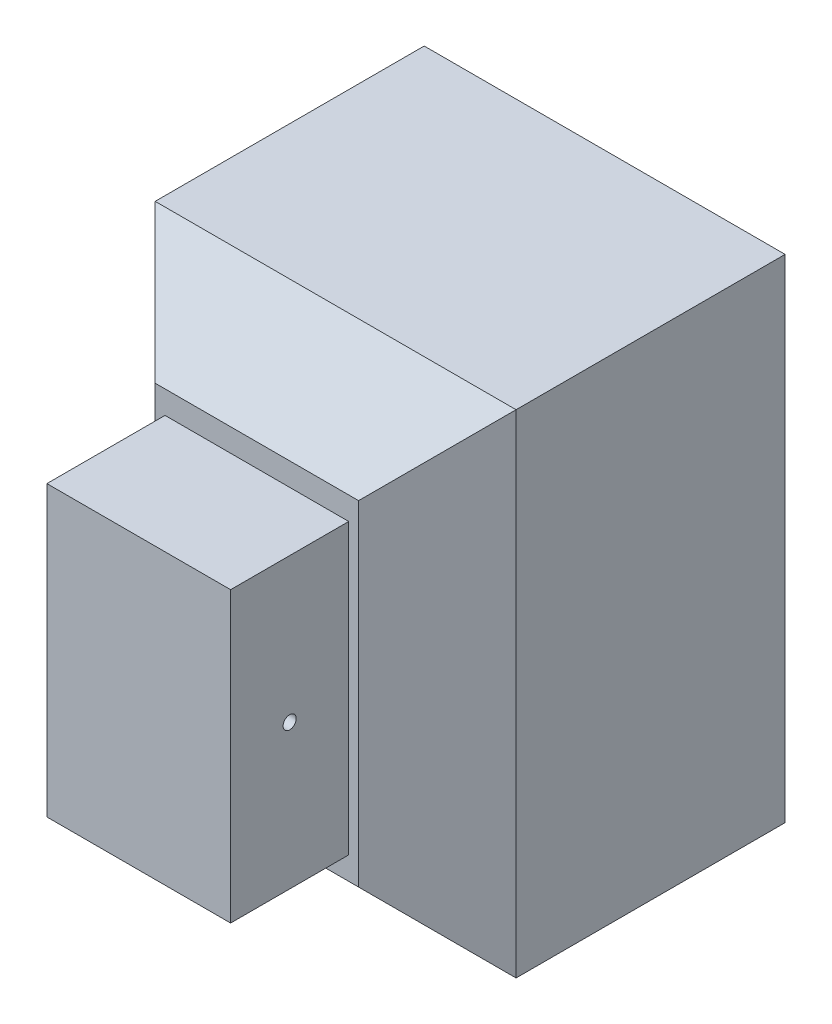
ISO-10303-21;
HEADER;
FILE_DESCRIPTION(('STEP AP214'),'2;1');
FILE_NAME('part.step','',(''),(''),'','','');
FILE_SCHEMA(('AUTOMOTIVE_DESIGN { 1 0 10303 214 1 1 1 1 }'));
ENDSEC;
DATA;
#1=APPLICATION_CONTEXT('core data for automotive mechanical design processes');
#2=APPLICATION_PROTOCOL_DEFINITION('international standard','automotive_design',2000,#1);
#3=PRODUCT_CONTEXT('',#1,'mechanical');
#4=PRODUCT('Part','Part','',(#3));
#5=PRODUCT_RELATED_PRODUCT_CATEGORY('part','',(#4));
#6=PRODUCT_DEFINITION_FORMATION('','',#4);
#7=PRODUCT_DEFINITION_CONTEXT('part definition',#1,'design');
#8=PRODUCT_DEFINITION('design','',#6,#7);
#9=PRODUCT_DEFINITION_SHAPE('','',#8);
#10=(LENGTH_UNIT() NAMED_UNIT(*) SI_UNIT(.MILLI.,.METRE.));
#11=(NAMED_UNIT(*) PLANE_ANGLE_UNIT() SI_UNIT($,.RADIAN.));
#12=(NAMED_UNIT(*) SI_UNIT($,.STERADIAN.) SOLID_ANGLE_UNIT());
#13=UNCERTAINTY_MEASURE_WITH_UNIT(LENGTH_MEASURE(1.E-05),#10,'distance_accuracy_value','');
#14=(GEOMETRIC_REPRESENTATION_CONTEXT(3) GLOBAL_UNCERTAINTY_ASSIGNED_CONTEXT((#13)) GLOBAL_UNIT_ASSIGNED_CONTEXT((#10,
#11,#12)) REPRESENTATION_CONTEXT('',''));
#15=CARTESIAN_POINT('',(0.,0.,0.));
#16=DIRECTION('',(0.,0.,1.));
#17=DIRECTION('',(1.,0.,0.));
#18=AXIS2_PLACEMENT_3D('',#15,#16,#17);
#19=CARTESIAN_POINT('',(55.,-32.1033210332103,29.2988929889299));
#20=DIRECTION('',(0.,0.,-1.));
#21=DIRECTION('',(-1.,0.,0.));
#22=AXIS2_PLACEMENT_3D('',#19,#20,#21);
#23=PLANE('',#22);
#24=DIRECTION('',(0.,-1.,0.));
#25=VECTOR('',#24,1.);
#26=CARTESIAN_POINT('',(12.0000000000001,-32.1033210332103,29.2988929889299));
#27=LINE('',#26,#25);
#28=CARTESIAN_POINT('',(12.0000000000001,30.8966789667896,29.2988929889299));
#29=VERTEX_POINT('',#28);
#30=CARTESIAN_POINT('',(12.0000000000001,-20.1033210332103,29.2988929889299));
#31=VERTEX_POINT('',#30);
#32=EDGE_CURVE('E185',#29,#31,#27,.T.);
#33=ORIENTED_EDGE('',*,*,#32,.T.);
#34=DIRECTION('',(1.,0.,0.));
#35=VECTOR('',#34,1.);
#36=CARTESIAN_POINT('',(55.,-20.1033210332103,29.2988929889299));
#37=LINE('',#36,#35);
#38=CARTESIAN_POINT('',(43.,-20.1033210332103,29.2988929889299));
#39=VERTEX_POINT('',#38);
#40=EDGE_CURVE('E187',#31,#39,#37,.T.);
#41=ORIENTED_EDGE('',*,*,#40,.T.);
#42=DIRECTION('',(0.,1.,0.));
#43=VECTOR('',#42,1.);
#44=CARTESIAN_POINT('',(43.,42.8966789667897,29.2988929889299));
#45=LINE('',#44,#43);
#46=CARTESIAN_POINT('',(43.,30.8966789667896,29.2988929889299));
#47=VERTEX_POINT('',#46);
#48=EDGE_CURVE('E181',#39,#47,#45,.T.);
#49=ORIENTED_EDGE('',*,*,#48,.T.);
#50=DIRECTION('',(-1.,0.,0.));
#51=VECTOR('',#50,1.);
#52=CARTESIAN_POINT('',(55.,30.8966789667896,29.2988929889299));
#53=LINE('',#52,#51);
#54=EDGE_CURVE('E183',#47,#29,#53,.T.);
#55=ORIENTED_EDGE('',*,*,#54,.T.);
#56=EDGE_LOOP('',(#33,#41,#49,#55));
#57=FACE_BOUND('',#56,.T.);
#58=DIRECTION('',(0.,-1.,0.));
#59=VECTOR('',#58,1.);
#60=CARTESIAN_POINT('',(13.5,27.3966789667897,29.2988929889299));
#61=LINE('',#60,#59);
#62=CARTESIAN_POINT('',(13.5,27.3966789667897,29.2988929889299));
#63=VERTEX_POINT('',#62);
#64=CARTESIAN_POINT('',(13.5,-16.6033210332103,29.2988929889299));
#65=VERTEX_POINT('',#64);
#66=EDGE_CURVE('E157',#63,#65,#61,.T.);
#67=ORIENTED_EDGE('',*,*,#66,.F.);
#68=DIRECTION('',(-1.,0.,0.));
#69=VECTOR('',#68,1.);
#70=CARTESIAN_POINT('',(13.5,27.3966789667897,29.2988929889299));
#71=LINE('',#70,#69);
#72=CARTESIAN_POINT('',(41.5,27.3966789667897,29.2988929889299));
#73=VERTEX_POINT('',#72);
#74=EDGE_CURVE('E154',#73,#63,#71,.T.);
#75=ORIENTED_EDGE('',*,*,#74,.F.);
#76=DIRECTION('',(0.,1.,0.));
#77=VECTOR('',#76,1.);
#78=CARTESIAN_POINT('',(41.5,27.3966789667897,29.2988929889299));
#79=LINE('',#78,#77);
#80=CARTESIAN_POINT('',(41.5,-16.6033210332103,29.2988929889299));
#81=VERTEX_POINT('',#80);
#82=EDGE_CURVE('E450',#81,#73,#79,.T.);
#83=ORIENTED_EDGE('',*,*,#82,.F.);
#84=DIRECTION('',(1.,0.,0.));
#85=VECTOR('',#84,1.);
#86=CARTESIAN_POINT('',(13.5,-16.6033210332103,29.2988929889299));
#87=LINE('',#86,#85);
#88=EDGE_CURVE('E448',#65,#81,#87,.T.);
#89=ORIENTED_EDGE('',*,*,#88,.F.);
#90=EDGE_LOOP('',(#67,#75,#83,#89));
#91=FACE_BOUND('',#90,.T.);
#92=ADVANCED_FACE('F41',(#57,#91),#23,.F.);
#93=CARTESIAN_POINT('',(55.,-32.1033210332103,29.2988929889299));
#94=DIRECTION('',(0.,1.,0.));
#95=DIRECTION('',(0.,0.,1.));
#96=AXIS2_PLACEMENT_3D('',#93,#94,#95);
#97=PLANE('',#96);
#98=DIRECTION('',(0.,0.,-1.));
#99=VECTOR('',#98,1.);
#100=CARTESIAN_POINT('',(55.,-32.1033210332103,29.2988929889299));
#101=LINE('',#100,#99);
#102=CARTESIAN_POINT('',(55.,-32.1033210332103,17.2988929889299));
#103=VERTEX_POINT('',#102);
#104=CARTESIAN_POINT('',(55.,-32.1033210332103,-23.7011070110701));
#105=VERTEX_POINT('',#104);
#106=EDGE_CURVE('E167',#103,#105,#101,.T.);
#107=ORIENTED_EDGE('',*,*,#106,.F.);
#108=DIRECTION('',(-1.,0.,0.));
#109=VECTOR('',#108,1.);
#110=CARTESIAN_POINT('',(55.,-32.1033210332103,17.2988929889299));
#111=LINE('',#110,#109);
#112=CARTESIAN_POINT('',(0.,-32.1033210332103,17.2988929889299));
#113=VERTEX_POINT('',#112);
#114=EDGE_CURVE('E178',#103,#113,#111,.T.);
#115=ORIENTED_EDGE('',*,*,#114,.T.);
#116=DIRECTION('',(0.,0.,-1.));
#117=VECTOR('',#116,1.);
#118=CARTESIAN_POINT('',(0.,-32.1033210332103,29.2988929889299));
#119=LINE('',#118,#117);
#120=CARTESIAN_POINT('',(0.,-32.1033210332103,-23.7011070110701));
#121=VERTEX_POINT('',#120);
#122=EDGE_CURVE('E158',#113,#121,#119,.T.);
#123=ORIENTED_EDGE('',*,*,#122,.T.);
#124=DIRECTION('',(1.,0.,0.));
#125=VECTOR('',#124,1.);
#126=CARTESIAN_POINT('',(55.,-32.1033210332103,-23.7011070110701));
#127=LINE('',#126,#125);
#128=EDGE_CURVE('E172',#121,#105,#127,.T.);
#129=ORIENTED_EDGE('',*,*,#128,.T.);
#130=EDGE_LOOP('',(#107,#115,#123,#129));
#131=FACE_BOUND('',#130,.T.);
#132=ADVANCED_FACE('F252',(#131),#97,.F.);
#133=CARTESIAN_POINT('',(55.,-32.1033210332103,-35.7011070110701));
#134=DIRECTION('',(0.,0.,1.));
#135=DIRECTION('',(1.,0.,0.));
#136=AXIS2_PLACEMENT_3D('',#133,#134,#135);
#137=PLANE('',#136);
#138=DIRECTION('',(0.,-1.,0.));
#139=VECTOR('',#138,1.);
#140=CARTESIAN_POINT('',(43.,-32.1033210332103,-35.7011070110701));
#141=LINE('',#140,#139);
#142=CARTESIAN_POINT('',(43.,30.8966789667896,-35.7011070110701));
#143=VERTEX_POINT('',#142);
#144=CARTESIAN_POINT('',(43.,-20.1033210332103,-35.7011070110701));
#145=VERTEX_POINT('',#144);
#146=EDGE_CURVE('E202',#143,#145,#141,.T.);
#147=ORIENTED_EDGE('',*,*,#146,.T.);
#148=DIRECTION('',(-1.,0.,0.));
#149=VECTOR('',#148,1.);
#150=CARTESIAN_POINT('',(55.,-20.1033210332103,-35.7011070110701));
#151=LINE('',#150,#149);
#152=CARTESIAN_POINT('',(12.0000000000001,-20.1033210332103,-35.7011070110701));
#153=VERTEX_POINT('',#152);
#154=EDGE_CURVE('E11',#145,#153,#151,.T.);
#155=ORIENTED_EDGE('',*,*,#154,.T.);
#156=DIRECTION('',(0.,1.,0.));
#157=VECTOR('',#156,1.);
#158=CARTESIAN_POINT('',(12.0000000000001,-32.1033210332103,-35.7011070110701));
#159=LINE('',#158,#157);
#160=CARTESIAN_POINT('',(12.0000000000001,30.8966789667896,-35.7011070110701));
#161=VERTEX_POINT('',#160);
#162=EDGE_CURVE('E51',#153,#161,#159,.T.);
#163=ORIENTED_EDGE('',*,*,#162,.T.);
#164=DIRECTION('',(1.,0.,0.));
#165=VECTOR('',#164,1.);
#166=CARTESIAN_POINT('',(55.,30.8966789667896,-35.7011070110701));
#167=LINE('',#166,#165);
#168=EDGE_CURVE('E204',#161,#143,#167,.T.);
#169=ORIENTED_EDGE('',*,*,#168,.T.);
#170=EDGE_LOOP('',(#147,#155,#163,#169));
#171=FACE_BOUND('',#170,.T.);
#172=ADVANCED_FACE('F284',(#171),#137,.F.);
#173=CARTESIAN_POINT('',(55.,42.8966789667897,29.2988929889299));
#174=DIRECTION('',(0.,-1.,0.));
#175=DIRECTION('',(0.,0.,-1.));
#176=AXIS2_PLACEMENT_3D('',#173,#174,#175);
#177=PLANE('',#176);
#178=DIRECTION('',(0.,0.,1.));
#179=VECTOR('',#178,1.);
#180=CARTESIAN_POINT('',(0.,42.8966789667897,29.2988929889299));
#181=LINE('',#180,#179);
#182=CARTESIAN_POINT('',(0.,42.8966789667897,-23.7011070110701));
#183=VERTEX_POINT('',#182);
#184=CARTESIAN_POINT('',(0.,42.8966789667897,17.2988929889299));
#185=VERTEX_POINT('',#184);
#186=EDGE_CURVE('E161',#183,#185,#181,.T.);
#187=ORIENTED_EDGE('',*,*,#186,.T.);
#188=DIRECTION('',(1.,0.,0.));
#189=VECTOR('',#188,1.);
#190=CARTESIAN_POINT('',(55.,42.8966789667897,17.2988929889299));
#191=LINE('',#190,#189);
#192=CARTESIAN_POINT('',(55.,42.8966789667897,17.2988929889299));
#193=VERTEX_POINT('',#192);
#194=EDGE_CURVE('E196',#185,#193,#191,.T.);
#195=ORIENTED_EDGE('',*,*,#194,.T.);
#196=DIRECTION('',(0.,0.,1.));
#197=VECTOR('',#196,1.);
#198=CARTESIAN_POINT('',(55.,42.8966789667897,29.2988929889299));
#199=LINE('',#198,#197);
#200=CARTESIAN_POINT('',(55.,42.8966789667897,-23.7011070110701));
#201=VERTEX_POINT('',#200);
#202=EDGE_CURVE('E170',#201,#193,#199,.T.);
#203=ORIENTED_EDGE('',*,*,#202,.F.);
#204=DIRECTION('',(-1.,0.,0.));
#205=VECTOR('',#204,1.);
#206=CARTESIAN_POINT('',(55.,42.8966789667897,-23.7011070110701));
#207=LINE('',#206,#205);
#208=EDGE_CURVE('E194',#201,#183,#207,.T.);
#209=ORIENTED_EDGE('',*,*,#208,.T.);
#210=EDGE_LOOP('',(#187,#195,#203,#209));
#211=FACE_BOUND('',#210,.T.);
#212=ADVANCED_FACE('F238',(#211),#177,.F.);
#213=CARTESIAN_POINT('',(55.,0.,0.));
#214=DIRECTION('',(1.,0.,0.));
#215=DIRECTION('',(0.,0.,-1.));
#216=AXIS2_PLACEMENT_3D('',#213,#214,#215);
#217=PLANE('',#216);
#218=ORIENTED_EDGE('',*,*,#202,.T.);
#219=DIRECTION('',(0.,-1.,0.));
#220=VECTOR('',#219,1.);
#221=CARTESIAN_POINT('',(55.,-32.1033210332103,17.2988929889299));
#222=LINE('',#221,#220);
#223=EDGE_CURVE('E200',#193,#103,#222,.T.);
#224=ORIENTED_EDGE('',*,*,#223,.T.);
#225=ORIENTED_EDGE('',*,*,#106,.T.);
#226=DIRECTION('',(0.,1.,0.));
#227=VECTOR('',#226,1.);
#228=CARTESIAN_POINT('',(55.,42.8966789667897,-23.7011070110701));
#229=LINE('',#228,#227);
#230=EDGE_CURVE('E198',#105,#201,#229,.T.);
#231=ORIENTED_EDGE('',*,*,#230,.T.);
#232=EDGE_LOOP('',(#218,#224,#225,#231));
#233=FACE_BOUND('',#232,.T.);
#234=ADVANCED_FACE('F266',(#233),#217,.T.);
#235=CARTESIAN_POINT('',(0.,0.,0.));
#236=DIRECTION('',(1.,0.,0.));
#237=DIRECTION('',(0.,0.,-1.));
#238=AXIS2_PLACEMENT_3D('',#235,#236,#237);
#239=PLANE('',#238);
#240=ORIENTED_EDGE('',*,*,#122,.F.);
#241=DIRECTION('',(0.,1.,0.));
#242=VECTOR('',#241,1.);
#243=CARTESIAN_POINT('',(0.,0.,17.2988929889299));
#244=LINE('',#243,#242);
#245=EDGE_CURVE('E192',#113,#185,#244,.T.);
#246=ORIENTED_EDGE('',*,*,#245,.T.);
#247=ORIENTED_EDGE('',*,*,#186,.F.);
#248=DIRECTION('',(0.,-1.,0.));
#249=VECTOR('',#248,1.);
#250=CARTESIAN_POINT('',(0.,0.,-23.7011070110701));
#251=LINE('',#250,#249);
#252=EDGE_CURVE('E190',#183,#121,#251,.T.);
#253=ORIENTED_EDGE('',*,*,#252,.T.);
#254=EDGE_LOOP('',(#240,#246,#247,#253));
#255=FACE_BOUND('',#254,.T.);
#256=ADVANCED_FACE('F242',(#255),#239,.F.);
#257=CARTESIAN_POINT('',(13.5,27.3966789667897,47.2988929889299));
#258=DIRECTION('',(1.,0.,0.));
#259=DIRECTION('',(0.,1.,0.));
#260=AXIS2_PLACEMENT_3D('',#257,#258,#259);
#261=PLANE('',#260);
#262=CARTESIAN_POINT('',(13.5,5.39667896678966,38.2988929889299));
#263=DIRECTION('',(1.,0.,0.));
#264=DIRECTION('',(0.,1.,0.));
#265=AXIS2_PLACEMENT_3D('',#262,#263,#264);
#266=CIRCLE('',#265,1.);
#267=CARTESIAN_POINT('',(13.5,6.39667896678966,38.2988929889299));
#268=VERTEX_POINT('',#267);
#269=EDGE_CURVE('E220',#268,#268,#266,.T.);
#270=ORIENTED_EDGE('',*,*,#269,.T.);
#271=EDGE_LOOP('',(#270));
#272=FACE_BOUND('',#271,.T.);
#273=ORIENTED_EDGE('',*,*,#66,.T.);
#274=DIRECTION('',(0.,0.,-1.));
#275=VECTOR('',#274,1.);
#276=CARTESIAN_POINT('',(13.5,-16.6033210332103,47.2988929889299));
#277=LINE('',#276,#275);
#278=CARTESIAN_POINT('',(13.5,-16.6033210332103,47.2988929889299));
#279=VERTEX_POINT('',#278);
#280=EDGE_CURVE('E138',#279,#65,#277,.T.);
#281=ORIENTED_EDGE('',*,*,#280,.F.);
#282=DIRECTION('',(0.,-1.,0.));
#283=VECTOR('',#282,1.);
#284=CARTESIAN_POINT('',(13.5,27.3966789667897,47.2988929889299));
#285=LINE('',#284,#283);
#286=CARTESIAN_POINT('',(13.5,27.3966789667897,47.2988929889299));
#287=VERTEX_POINT('',#286);
#288=EDGE_CURVE('E145',#287,#279,#285,.T.);
#289=ORIENTED_EDGE('',*,*,#288,.F.);
#290=DIRECTION('',(0.,0.,-1.));
#291=VECTOR('',#290,1.);
#292=CARTESIAN_POINT('',(13.5,27.3966789667897,47.2988929889299));
#293=LINE('',#292,#291);
#294=EDGE_CURVE('E446',#287,#63,#293,.T.);
#295=ORIENTED_EDGE('',*,*,#294,.T.);
#296=EDGE_LOOP('',(#273,#281,#289,#295));
#297=FACE_BOUND('',#296,.T.);
#298=ADVANCED_FACE('F156',(#272,#297),#261,.F.);
#299=CARTESIAN_POINT('',(13.5,-16.6033210332103,47.2988929889299));
#300=DIRECTION('',(0.,1.,0.));
#301=DIRECTION('',(-1.,0.,0.));
#302=AXIS2_PLACEMENT_3D('',#299,#300,#301);
#303=PLANE('',#302);
#304=ORIENTED_EDGE('',*,*,#88,.T.);
#305=DIRECTION('',(0.,0.,-1.));
#306=VECTOR('',#305,1.);
#307=CARTESIAN_POINT('',(41.5,-16.6033210332103,47.2988929889299));
#308=LINE('',#307,#306);
#309=CARTESIAN_POINT('',(41.5,-16.6033210332103,47.2988929889299));
#310=VERTEX_POINT('',#309);
#311=EDGE_CURVE('E141',#310,#81,#308,.T.);
#312=ORIENTED_EDGE('',*,*,#311,.F.);
#313=DIRECTION('',(1.,0.,0.));
#314=VECTOR('',#313,1.);
#315=CARTESIAN_POINT('',(13.5,-16.6033210332103,47.2988929889299));
#316=LINE('',#315,#314);
#317=EDGE_CURVE('E133',#279,#310,#316,.T.);
#318=ORIENTED_EDGE('',*,*,#317,.F.);
#319=ORIENTED_EDGE('',*,*,#280,.T.);
#320=EDGE_LOOP('',(#304,#312,#318,#319));
#321=FACE_BOUND('',#320,.T.);
#322=ADVANCED_FACE('F136',(#321),#303,.F.);
#323=CARTESIAN_POINT('',(41.5,27.3966789667897,47.2988929889299));
#324=DIRECTION('',(-1.,0.,0.));
#325=DIRECTION('',(0.,0.,1.));
#326=AXIS2_PLACEMENT_3D('',#323,#324,#325);
#327=PLANE('',#326);
#328=CARTESIAN_POINT('',(41.5,5.39667896678966,38.2988929889299));
#329=DIRECTION('',(-1.,0.,0.));
#330=DIRECTION('',(0.,0.,1.));
#331=AXIS2_PLACEMENT_3D('',#328,#329,#330);
#332=CIRCLE('',#331,1.);
#333=CARTESIAN_POINT('',(41.5,5.39667896678966,39.2988929889299));
#334=VERTEX_POINT('',#333);
#335=EDGE_CURVE('E46',#334,#334,#332,.T.);
#336=ORIENTED_EDGE('',*,*,#335,.T.);
#337=EDGE_LOOP('',(#336));
#338=FACE_BOUND('',#337,.T.);
#339=ORIENTED_EDGE('',*,*,#82,.T.);
#340=DIRECTION('',(0.,0.,-1.));
#341=VECTOR('',#340,1.);
#342=CARTESIAN_POINT('',(41.5,27.3966789667897,47.2988929889299));
#343=LINE('',#342,#341);
#344=CARTESIAN_POINT('',(41.5,27.3966789667897,47.2988929889299));
#345=VERTEX_POINT('',#344);
#346=EDGE_CURVE('E163',#345,#73,#343,.T.);
#347=ORIENTED_EDGE('',*,*,#346,.F.);
#348=DIRECTION('',(0.,1.,0.));
#349=VECTOR('',#348,1.);
#350=CARTESIAN_POINT('',(41.5,27.3966789667897,47.2988929889299));
#351=LINE('',#350,#349);
#352=EDGE_CURVE('E144',#310,#345,#351,.T.);
#353=ORIENTED_EDGE('',*,*,#352,.F.);
#354=ORIENTED_EDGE('',*,*,#311,.T.);
#355=EDGE_LOOP('',(#339,#347,#353,#354));
#356=FACE_BOUND('',#355,.T.);
#357=ADVANCED_FACE('F367',(#338,#356),#327,.F.);
#358=CARTESIAN_POINT('',(13.5,27.3966789667897,47.2988929889299));
#359=DIRECTION('',(0.,-1.,0.));
#360=DIRECTION('',(1.,0.,0.));
#361=AXIS2_PLACEMENT_3D('',#358,#359,#360);
#362=PLANE('',#361);
#363=ORIENTED_EDGE('',*,*,#74,.T.);
#364=ORIENTED_EDGE('',*,*,#294,.F.);
#365=DIRECTION('',(-1.,0.,0.));
#366=VECTOR('',#365,1.);
#367=CARTESIAN_POINT('',(13.5,27.3966789667897,47.2988929889299));
#368=LINE('',#367,#366);
#369=EDGE_CURVE('E150',#345,#287,#368,.T.);
#370=ORIENTED_EDGE('',*,*,#369,.F.);
#371=ORIENTED_EDGE('',*,*,#346,.T.);
#372=EDGE_LOOP('',(#363,#364,#370,#371));
#373=FACE_BOUND('',#372,.T.);
#374=ADVANCED_FACE('F358',(#373),#362,.F.);
#375=CARTESIAN_POINT('',(0.,0.,47.2988929889299));
#376=DIRECTION('',(0.,0.,1.));
#377=DIRECTION('',(1.,0.,0.));
#378=AXIS2_PLACEMENT_3D('',#375,#376,#377);
#379=PLANE('',#378);
#380=ORIENTED_EDGE('',*,*,#288,.T.);
#381=ORIENTED_EDGE('',*,*,#317,.T.);
#382=ORIENTED_EDGE('',*,*,#352,.T.);
#383=ORIENTED_EDGE('',*,*,#369,.T.);
#384=EDGE_LOOP('',(#380,#381,#382,#383));
#385=FACE_BOUND('',#384,.T.);
#386=ADVANCED_FACE('F148',(#385),#379,.T.);
#387=CARTESIAN_POINT('',(55.,30.8966789667896,29.2988929889299));
#388=DIRECTION('',(0.,-0.707106781186546,-0.707106781186549));
#389=DIRECTION('',(-1.,0.,0.));
#390=AXIS2_PLACEMENT_3D('',#387,#388,#389);
#391=PLANE('',#390);
#392=DIRECTION('',(0.577350269189626,-0.577350269189627,0.577350269189625));
#393=VECTOR('',#392,1.);
#394=CARTESIAN_POINT('',(26.3333333333334,16.5633456334563,43.6322263222632));
#395=LINE('',#394,#393);
#396=EDGE_CURVE('E212',#29,#185,#395,.F.);
#397=ORIENTED_EDGE('',*,*,#396,.F.);
#398=ORIENTED_EDGE('',*,*,#54,.F.);
#399=DIRECTION('',(0.577350269189626,0.577350269189627,-0.577350269189624));
#400=VECTOR('',#399,1.);
#401=CARTESIAN_POINT('',(40.7011070110701,28.5977859778597,31.5977859778597));
#402=LINE('',#401,#400);
#403=EDGE_CURVE('E215',#193,#47,#402,.F.);
#404=ORIENTED_EDGE('',*,*,#403,.F.);
#405=ORIENTED_EDGE('',*,*,#194,.F.);
#406=EDGE_LOOP('',(#397,#398,#404,#405));
#407=FACE_BOUND('',#406,.T.);
#408=ADVANCED_FACE('F263',(#407),#391,.F.);
#409=CARTESIAN_POINT('',(55.,0.,17.2988929889299));
#410=DIRECTION('',(0.707106781186546,0.,0.707106781186549));
#411=DIRECTION('',(0.,1.,0.));
#412=AXIS2_PLACEMENT_3D('',#409,#410,#411);
#413=PLANE('',#412);
#414=ORIENTED_EDGE('',*,*,#403,.T.);
#415=ORIENTED_EDGE('',*,*,#48,.F.);
#416=DIRECTION('',(-0.577350269189627,0.577350269189627,0.577350269189625));
#417=VECTOR('',#416,1.);
#418=CARTESIAN_POINT('',(44.2988929889299,-21.4022140221402,28.));
#419=LINE('',#418,#417);
#420=EDGE_CURVE('E209',#103,#39,#419,.T.);
#421=ORIENTED_EDGE('',*,*,#420,.F.);
#422=ORIENTED_EDGE('',*,*,#223,.F.);
#423=EDGE_LOOP('',(#414,#415,#421,#422));
#424=FACE_BOUND('',#423,.T.);
#425=ADVANCED_FACE('F268',(#424),#413,.T.);
#426=CARTESIAN_POINT('',(12.0000000000001,-32.1033210332103,29.2988929889299));
#427=DIRECTION('',(0.707106781186546,0.,-0.707106781186549));
#428=DIRECTION('',(0.,-1.,0.));
#429=AXIS2_PLACEMENT_3D('',#426,#427,#428);
#430=PLANE('',#429);
#431=ORIENTED_EDGE('',*,*,#396,.T.);
#432=ORIENTED_EDGE('',*,*,#245,.F.);
#433=DIRECTION('',(0.577350269189627,0.577350269189627,0.577350269189625));
#434=VECTOR('',#433,1.);
#435=CARTESIAN_POINT('',(8.00000000000002,-24.1033210332103,25.2988929889299));
#436=LINE('',#435,#434);
#437=EDGE_CURVE('E207',#31,#113,#436,.F.);
#438=ORIENTED_EDGE('',*,*,#437,.F.);
#439=ORIENTED_EDGE('',*,*,#32,.F.);
#440=EDGE_LOOP('',(#431,#432,#438,#439));
#441=FACE_BOUND('',#440,.T.);
#442=ADVANCED_FACE('F246',(#441),#430,.F.);
#443=CARTESIAN_POINT('',(55.,-32.1033210332103,17.2988929889299));
#444=DIRECTION('',(0.,0.707106781186546,-0.707106781186549));
#445=DIRECTION('',(-1.,0.,0.));
#446=AXIS2_PLACEMENT_3D('',#443,#444,#445);
#447=PLANE('',#446);
#448=ORIENTED_EDGE('',*,*,#420,.T.);
#449=ORIENTED_EDGE('',*,*,#40,.F.);
#450=ORIENTED_EDGE('',*,*,#437,.T.);
#451=ORIENTED_EDGE('',*,*,#114,.F.);
#452=EDGE_LOOP('',(#448,#449,#450,#451));
#453=FACE_BOUND('',#452,.T.);
#454=ADVANCED_FACE('F255',(#453),#447,.F.);
#455=CARTESIAN_POINT('',(55.,42.8966789667897,-23.7011070110701));
#456=DIRECTION('',(0.,-0.707106781186546,0.707106781186549));
#457=DIRECTION('',(-1.,0.,0.));
#458=AXIS2_PLACEMENT_3D('',#455,#456,#457);
#459=PLANE('',#458);
#460=DIRECTION('',(-0.577350269189626,0.577350269189626,0.577350269189624));
#461=VECTOR('',#460,1.);
#462=CARTESIAN_POINT('',(18.3333333333334,24.5633456334563,-42.0344403444034));
#463=LINE('',#462,#461);
#464=EDGE_CURVE('E222',#183,#161,#463,.F.);
#465=ORIENTED_EDGE('',*,*,#464,.F.);
#466=ORIENTED_EDGE('',*,*,#208,.F.);
#467=DIRECTION('',(-0.577350269189626,-0.577350269189626,-0.577350269189624));
#468=VECTOR('',#467,1.);
#469=CARTESIAN_POINT('',(40.7011070110701,28.5977859778597,-38.));
#470=LINE('',#469,#468);
#471=EDGE_CURVE('E210',#143,#201,#470,.F.);
#472=ORIENTED_EDGE('',*,*,#471,.F.);
#473=ORIENTED_EDGE('',*,*,#168,.F.);
#474=EDGE_LOOP('',(#465,#466,#472,#473));
#475=FACE_BOUND('',#474,.T.);
#476=ADVANCED_FACE('F44',(#475),#459,.F.);
#477=CARTESIAN_POINT('',(55.,0.,-23.7011070110701));
#478=DIRECTION('',(0.707106781186546,0.,-0.707106781186549));
#479=DIRECTION('',(0.,-1.,0.));
#480=AXIS2_PLACEMENT_3D('',#477,#478,#479);
#481=PLANE('',#480);
#482=ORIENTED_EDGE('',*,*,#471,.T.);
#483=ORIENTED_EDGE('',*,*,#230,.F.);
#484=DIRECTION('',(0.577350269189627,-0.577350269189626,0.577350269189625));
#485=VECTOR('',#484,1.);
#486=CARTESIAN_POINT('',(44.2988929889299,-21.4022140221402,-34.4022140221402));
#487=LINE('',#486,#485);
#488=EDGE_CURVE('E219',#145,#105,#487,.T.);
#489=ORIENTED_EDGE('',*,*,#488,.F.);
#490=ORIENTED_EDGE('',*,*,#146,.F.);
#491=EDGE_LOOP('',(#482,#483,#489,#490));
#492=FACE_BOUND('',#491,.T.);
#493=ADVANCED_FACE('F229',(#492),#481,.T.);
#494=CARTESIAN_POINT('',(12.0000000000001,-32.1033210332103,-35.7011070110701));
#495=DIRECTION('',(0.707106781186546,0.,0.707106781186549));
#496=DIRECTION('',(0.,1.,0.));
#497=AXIS2_PLACEMENT_3D('',#494,#495,#496);
#498=PLANE('',#497);
#499=ORIENTED_EDGE('',*,*,#464,.T.);
#500=ORIENTED_EDGE('',*,*,#162,.F.);
#501=DIRECTION('',(-0.577350269189627,-0.577350269189626,0.577350269189625));
#502=VECTOR('',#501,1.);
#503=CARTESIAN_POINT('',(8.00000000000003,-24.1033210332103,-31.7011070110701));
#504=LINE('',#503,#502);
#505=EDGE_CURVE('E59',#121,#153,#504,.F.);
#506=ORIENTED_EDGE('',*,*,#505,.F.);
#507=ORIENTED_EDGE('',*,*,#252,.F.);
#508=EDGE_LOOP('',(#499,#500,#506,#507));
#509=FACE_BOUND('',#508,.T.);
#510=ADVANCED_FACE('F314',(#509),#498,.F.);
#511=CARTESIAN_POINT('',(55.,-20.1033210332103,-35.7011070110701));
#512=DIRECTION('',(0.,0.707106781186546,0.707106781186549));
#513=DIRECTION('',(-1.,0.,0.));
#514=AXIS2_PLACEMENT_3D('',#511,#512,#513);
#515=PLANE('',#514);
#516=ORIENTED_EDGE('',*,*,#488,.T.);
#517=ORIENTED_EDGE('',*,*,#128,.F.);
#518=ORIENTED_EDGE('',*,*,#505,.T.);
#519=ORIENTED_EDGE('',*,*,#154,.F.);
#520=EDGE_LOOP('',(#516,#517,#518,#519));
#521=FACE_BOUND('',#520,.T.);
#522=ADVANCED_FACE('F307',(#521),#515,.F.);
#523=CARTESIAN_POINT('',(0.,5.39667896678966,38.2988929889299));
#524=DIRECTION('',(1.,0.,0.));
#525=DIRECTION('',(0.,0.,-1.));
#526=AXIS2_PLACEMENT_3D('',#523,#524,#525);
#527=CYLINDRICAL_SURFACE('',#526,1.);
#528=ORIENTED_EDGE('',*,*,#335,.F.);
#529=EDGE_LOOP('',(#528));
#530=FACE_BOUND('',#529,.T.);
#531=ORIENTED_EDGE('',*,*,#269,.F.);
#532=EDGE_LOOP('',(#531));
#533=FACE_BOUND('',#532,.T.);
#534=ADVANCED_FACE('F313',(#530,#533),#527,.F.);
#535=CLOSED_SHELL('',(#92,#132,#172,#212,#234,#256,#298,#322,#357,#374,#386,#408,#425,#442,#454,
#476,#493,#510,#522,#534));
#536=MANIFOLD_SOLID_BREP('B2',#535);
#537=ADVANCED_BREP_SHAPE_REPRESENTATION('',(#18,#536),#14);
#538=SHAPE_DEFINITION_REPRESENTATION(#9,#537);
ENDSEC;
END-ISO-10303-21;
